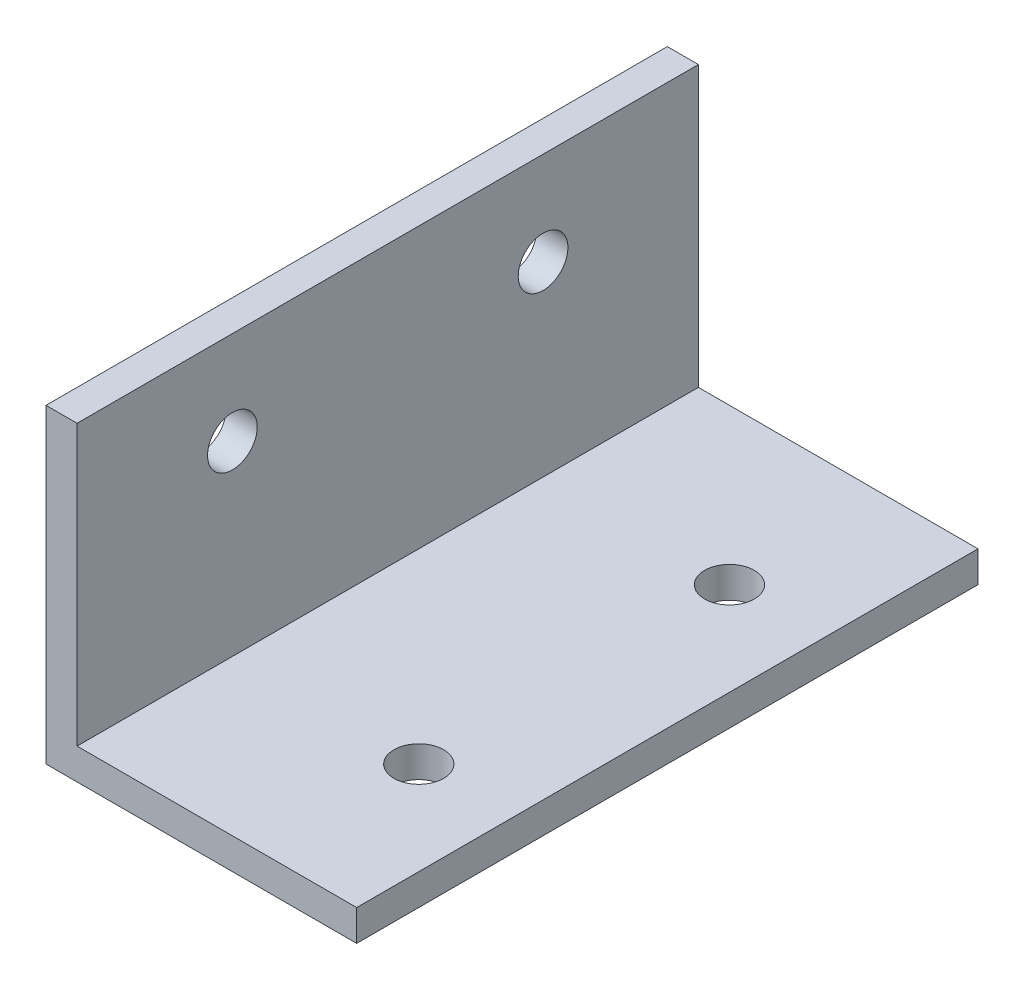
ISO-10303-21;
HEADER;
FILE_DESCRIPTION(('STEP AP214'),'2;1');
FILE_NAME('part.step','',(''),(''),'','','');
FILE_SCHEMA(('AUTOMOTIVE_DESIGN { 1 0 10303 214 1 1 1 1 }'));
ENDSEC;
DATA;
#1=APPLICATION_CONTEXT('core data for automotive mechanical design processes');
#2=APPLICATION_PROTOCOL_DEFINITION('international standard','automotive_design',2000,#1);
#3=PRODUCT_CONTEXT('',#1,'mechanical');
#4=PRODUCT('Part','Part','',(#3));
#5=PRODUCT_RELATED_PRODUCT_CATEGORY('part','',(#4));
#6=PRODUCT_DEFINITION_FORMATION('','',#4);
#7=PRODUCT_DEFINITION_CONTEXT('part definition',#1,'design');
#8=PRODUCT_DEFINITION('design','',#6,#7);
#9=PRODUCT_DEFINITION_SHAPE('','',#8);
#10=(LENGTH_UNIT() NAMED_UNIT(*) SI_UNIT(.MILLI.,.METRE.));
#11=(NAMED_UNIT(*) PLANE_ANGLE_UNIT() SI_UNIT($,.RADIAN.));
#12=(NAMED_UNIT(*) SI_UNIT($,.STERADIAN.) SOLID_ANGLE_UNIT());
#13=UNCERTAINTY_MEASURE_WITH_UNIT(LENGTH_MEASURE(1.E-05),#10,'distance_accuracy_value','');
#14=(GEOMETRIC_REPRESENTATION_CONTEXT(3) GLOBAL_UNCERTAINTY_ASSIGNED_CONTEXT((#13)) GLOBAL_UNIT_ASSIGNED_CONTEXT((#10,
#11,#12)) REPRESENTATION_CONTEXT('',''));
#15=CARTESIAN_POINT('',(0.,0.,0.));
#16=DIRECTION('',(0.,0.,1.));
#17=DIRECTION('',(1.,0.,0.));
#18=AXIS2_PLACEMENT_3D('',#15,#16,#17);
#19=CARTESIAN_POINT('',(0.,0.,50.));
#20=DIRECTION('',(1.,0.,0.));
#21=DIRECTION('',(0.,0.,-1.));
#22=AXIS2_PLACEMENT_3D('',#19,#20,#21);
#23=PLANE('',#22);
#24=CARTESIAN_POINT('',(0.,35.,25.));
#25=DIRECTION('',(1.,0.,0.));
#26=DIRECTION('',(0.,0.,-1.));
#27=AXIS2_PLACEMENT_3D('',#24,#25,#26);
#28=CIRCLE('',#27,3.99999999999999);
#29=CARTESIAN_POINT('',(0.,35.,21.));
#30=VERTEX_POINT('',#29);
#31=EDGE_CURVE('E162',#30,#30,#28,.T.);
#32=ORIENTED_EDGE('',*,*,#31,.T.);
#33=EDGE_LOOP('',(#32));
#34=FACE_BOUND('',#33,.T.);
#35=CARTESIAN_POINT('',(0.,35.,-25.));
#36=DIRECTION('',(1.,0.,0.));
#37=DIRECTION('',(0.,0.,-1.));
#38=AXIS2_PLACEMENT_3D('',#35,#36,#37);
#39=CIRCLE('',#38,4.00000000000001);
#40=CARTESIAN_POINT('',(0.,35.,-29.));
#41=VERTEX_POINT('',#40);
#42=EDGE_CURVE('E165',#41,#41,#39,.T.);
#43=ORIENTED_EDGE('',*,*,#42,.T.);
#44=EDGE_LOOP('',(#43));
#45=FACE_BOUND('',#44,.T.);
#46=DIRECTION('',(0.,-1.,0.));
#47=VECTOR('',#46,1.);
#48=CARTESIAN_POINT('',(0.,0.,-50.));
#49=LINE('',#48,#47);
#50=CARTESIAN_POINT('',(0.,50.,-50.));
#51=VERTEX_POINT('',#50);
#52=CARTESIAN_POINT('',(0.,0.,-50.));
#53=VERTEX_POINT('',#52);
#54=EDGE_CURVE('E117',#51,#53,#49,.T.);
#55=ORIENTED_EDGE('',*,*,#54,.T.);
#56=DIRECTION('',(0.,0.,-1.));
#57=VECTOR('',#56,1.);
#58=CARTESIAN_POINT('',(0.,0.,50.));
#59=LINE('',#58,#57);
#60=CARTESIAN_POINT('',(0.,0.,50.));
#61=VERTEX_POINT('',#60);
#62=EDGE_CURVE('E11',#61,#53,#59,.T.);
#63=ORIENTED_EDGE('',*,*,#62,.F.);
#64=DIRECTION('',(0.,-1.,0.));
#65=VECTOR('',#64,1.);
#66=CARTESIAN_POINT('',(0.,0.,50.));
#67=LINE('',#66,#65);
#68=CARTESIAN_POINT('',(0.,50.,50.));
#69=VERTEX_POINT('',#68);
#70=EDGE_CURVE('E128',#69,#61,#67,.T.);
#71=ORIENTED_EDGE('',*,*,#70,.F.);
#72=DIRECTION('',(0.,0.,-1.));
#73=VECTOR('',#72,1.);
#74=CARTESIAN_POINT('',(0.,50.,50.));
#75=LINE('',#74,#73);
#76=EDGE_CURVE('E113',#69,#51,#75,.T.);
#77=ORIENTED_EDGE('',*,*,#76,.T.);
#78=EDGE_LOOP('',(#55,#63,#71,#77));
#79=FACE_BOUND('',#78,.T.);
#80=ADVANCED_FACE('F33',(#34,#45,#79),#23,.F.);
#81=CARTESIAN_POINT('',(50.,0.,50.));
#82=DIRECTION('',(0.,1.,0.));
#83=DIRECTION('',(-1.,0.,0.));
#84=AXIS2_PLACEMENT_3D('',#81,#82,#83);
#85=PLANE('',#84);
#86=CARTESIAN_POINT('',(35.,0.,-25.));
#87=DIRECTION('',(0.,1.,0.));
#88=DIRECTION('',(-1.,0.,0.));
#89=AXIS2_PLACEMENT_3D('',#86,#87,#88);
#90=CIRCLE('',#89,4.00000000000001);
#91=CARTESIAN_POINT('',(31.,0.,-25.));
#92=VERTEX_POINT('',#91);
#93=EDGE_CURVE('E121',#92,#92,#90,.T.);
#94=ORIENTED_EDGE('',*,*,#93,.T.);
#95=EDGE_LOOP('',(#94));
#96=FACE_BOUND('',#95,.T.);
#97=CARTESIAN_POINT('',(35.,0.,25.));
#98=DIRECTION('',(0.,1.,0.));
#99=DIRECTION('',(-1.,0.,0.));
#100=AXIS2_PLACEMENT_3D('',#97,#98,#99);
#101=CIRCLE('',#100,4.00000000000001);
#102=CARTESIAN_POINT('',(31.,0.,25.));
#103=VERTEX_POINT('',#102);
#104=EDGE_CURVE('E181',#103,#103,#101,.T.);
#105=ORIENTED_EDGE('',*,*,#104,.T.);
#106=EDGE_LOOP('',(#105));
#107=FACE_BOUND('',#106,.T.);
#108=DIRECTION('',(1.,0.,0.));
#109=VECTOR('',#108,1.);
#110=CARTESIAN_POINT('',(50.,0.,-50.));
#111=LINE('',#110,#109);
#112=CARTESIAN_POINT('',(50.,0.,-50.));
#113=VERTEX_POINT('',#112);
#114=EDGE_CURVE('E120',#53,#113,#111,.T.);
#115=ORIENTED_EDGE('',*,*,#114,.T.);
#116=DIRECTION('',(0.,0.,-1.));
#117=VECTOR('',#116,1.);
#118=CARTESIAN_POINT('',(50.,0.,50.));
#119=LINE('',#118,#117);
#120=CARTESIAN_POINT('',(50.,0.,50.));
#121=VERTEX_POINT('',#120);
#122=EDGE_CURVE('E41',#121,#113,#119,.T.);
#123=ORIENTED_EDGE('',*,*,#122,.F.);
#124=DIRECTION('',(1.,0.,0.));
#125=VECTOR('',#124,1.);
#126=CARTESIAN_POINT('',(50.,0.,50.));
#127=LINE('',#126,#125);
#128=EDGE_CURVE('E86',#61,#121,#127,.T.);
#129=ORIENTED_EDGE('',*,*,#128,.F.);
#130=ORIENTED_EDGE('',*,*,#62,.T.);
#131=EDGE_LOOP('',(#115,#123,#129,#130));
#132=FACE_BOUND('',#131,.T.);
#133=ADVANCED_FACE('F153',(#96,#107,#132),#85,.F.);
#134=CARTESIAN_POINT('',(50.,5.,50.));
#135=DIRECTION('',(-1.,0.,0.));
#136=DIRECTION('',(0.,0.,1.));
#137=AXIS2_PLACEMENT_3D('',#134,#135,#136);
#138=PLANE('',#137);
#139=DIRECTION('',(0.,1.,0.));
#140=VECTOR('',#139,1.);
#141=CARTESIAN_POINT('',(50.,5.,-50.));
#142=LINE('',#141,#140);
#143=CARTESIAN_POINT('',(50.,5.,-50.));
#144=VERTEX_POINT('',#143);
#145=EDGE_CURVE('E123',#113,#144,#142,.T.);
#146=ORIENTED_EDGE('',*,*,#145,.T.);
#147=DIRECTION('',(0.,0.,-1.));
#148=VECTOR('',#147,1.);
#149=CARTESIAN_POINT('',(50.,5.,50.));
#150=LINE('',#149,#148);
#151=CARTESIAN_POINT('',(50.,5.,50.));
#152=VERTEX_POINT('',#151);
#153=EDGE_CURVE('E108',#152,#144,#150,.T.);
#154=ORIENTED_EDGE('',*,*,#153,.F.);
#155=DIRECTION('',(0.,1.,0.));
#156=VECTOR('',#155,1.);
#157=CARTESIAN_POINT('',(50.,5.,50.));
#158=LINE('',#157,#156);
#159=EDGE_CURVE('E99',#121,#152,#158,.T.);
#160=ORIENTED_EDGE('',*,*,#159,.F.);
#161=ORIENTED_EDGE('',*,*,#122,.T.);
#162=EDGE_LOOP('',(#146,#154,#160,#161));
#163=FACE_BOUND('',#162,.T.);
#164=ADVANCED_FACE('F134',(#163),#138,.F.);
#165=CARTESIAN_POINT('',(5.00000000000001,5.,50.));
#166=DIRECTION('',(0.,-1.,0.));
#167=DIRECTION('',(1.,0.,0.));
#168=AXIS2_PLACEMENT_3D('',#165,#166,#167);
#169=PLANE('',#168);
#170=CARTESIAN_POINT('',(35.,5.,-25.));
#171=DIRECTION('',(0.,1.,0.));
#172=DIRECTION('',(-1.,0.,0.));
#173=AXIS2_PLACEMENT_3D('',#170,#171,#172);
#174=CIRCLE('',#173,4.00000000000001);
#175=CARTESIAN_POINT('',(31.,5.,-25.));
#176=VERTEX_POINT('',#175);
#177=EDGE_CURVE('E178',#176,#176,#174,.T.);
#178=ORIENTED_EDGE('',*,*,#177,.F.);
#179=EDGE_LOOP('',(#178));
#180=FACE_BOUND('',#179,.T.);
#181=CARTESIAN_POINT('',(35.,5.,25.));
#182=DIRECTION('',(0.,1.,0.));
#183=DIRECTION('',(-1.,0.,0.));
#184=AXIS2_PLACEMENT_3D('',#181,#182,#183);
#185=CIRCLE('',#184,4.00000000000001);
#186=CARTESIAN_POINT('',(31.,5.,25.));
#187=VERTEX_POINT('',#186);
#188=EDGE_CURVE('E169',#187,#187,#185,.T.);
#189=ORIENTED_EDGE('',*,*,#188,.F.);
#190=EDGE_LOOP('',(#189));
#191=FACE_BOUND('',#190,.T.);
#192=DIRECTION('',(-1.,0.,0.));
#193=VECTOR('',#192,1.);
#194=CARTESIAN_POINT('',(5.00000000000001,5.,-50.));
#195=LINE('',#194,#193);
#196=CARTESIAN_POINT('',(5.00000000000001,5.,-50.));
#197=VERTEX_POINT('',#196);
#198=EDGE_CURVE('E107',#144,#197,#195,.T.);
#199=ORIENTED_EDGE('',*,*,#198,.T.);
#200=DIRECTION('',(0.,0.,-1.));
#201=VECTOR('',#200,1.);
#202=CARTESIAN_POINT('',(5.00000000000001,5.,50.));
#203=LINE('',#202,#201);
#204=CARTESIAN_POINT('',(5.00000000000001,5.,50.));
#205=VERTEX_POINT('',#204);
#206=EDGE_CURVE('E104',#205,#197,#203,.T.);
#207=ORIENTED_EDGE('',*,*,#206,.F.);
#208=DIRECTION('',(-1.,0.,0.));
#209=VECTOR('',#208,1.);
#210=CARTESIAN_POINT('',(5.00000000000001,5.,50.));
#211=LINE('',#210,#209);
#212=EDGE_CURVE('E93',#152,#205,#211,.T.);
#213=ORIENTED_EDGE('',*,*,#212,.F.);
#214=ORIENTED_EDGE('',*,*,#153,.T.);
#215=EDGE_LOOP('',(#199,#207,#213,#214));
#216=FACE_BOUND('',#215,.T.);
#217=ADVANCED_FACE('F105',(#180,#191,#216),#169,.F.);
#218=CARTESIAN_POINT('',(5.,50.,50.));
#219=DIRECTION('',(-1.,0.,0.));
#220=DIRECTION('',(0.,-1.,0.));
#221=AXIS2_PLACEMENT_3D('',#218,#219,#220);
#222=PLANE('',#221);
#223=CARTESIAN_POINT('',(5.,35.,25.));
#224=DIRECTION('',(1.,0.,0.));
#225=DIRECTION('',(0.,1.,0.));
#226=AXIS2_PLACEMENT_3D('',#223,#224,#225);
#227=CIRCLE('',#226,3.99999999999999);
#228=CARTESIAN_POINT('',(5.,39.,25.));
#229=VERTEX_POINT('',#228);
#230=EDGE_CURVE('E167',#229,#229,#227,.T.);
#231=ORIENTED_EDGE('',*,*,#230,.F.);
#232=EDGE_LOOP('',(#231));
#233=FACE_BOUND('',#232,.T.);
#234=CARTESIAN_POINT('',(5.,35.,-25.));
#235=DIRECTION('',(1.,0.,0.));
#236=DIRECTION('',(0.,1.,0.));
#237=AXIS2_PLACEMENT_3D('',#234,#235,#236);
#238=CIRCLE('',#237,4.00000000000001);
#239=CARTESIAN_POINT('',(5.,39.,-25.));
#240=VERTEX_POINT('',#239);
#241=EDGE_CURVE('E172',#240,#240,#238,.T.);
#242=ORIENTED_EDGE('',*,*,#241,.F.);
#243=EDGE_LOOP('',(#242));
#244=FACE_BOUND('',#243,.T.);
#245=DIRECTION('',(0.,1.,0.));
#246=VECTOR('',#245,1.);
#247=CARTESIAN_POINT('',(5.,50.,-50.));
#248=LINE('',#247,#246);
#249=CARTESIAN_POINT('',(5.,50.,-50.));
#250=VERTEX_POINT('',#249);
#251=EDGE_CURVE('E72',#197,#250,#248,.T.);
#252=ORIENTED_EDGE('',*,*,#251,.T.);
#253=DIRECTION('',(0.,0.,-1.));
#254=VECTOR('',#253,1.);
#255=CARTESIAN_POINT('',(5.,50.,50.));
#256=LINE('',#255,#254);
#257=CARTESIAN_POINT('',(5.,50.,50.));
#258=VERTEX_POINT('',#257);
#259=EDGE_CURVE('E109',#258,#250,#256,.T.);
#260=ORIENTED_EDGE('',*,*,#259,.F.);
#261=DIRECTION('',(0.,1.,0.));
#262=VECTOR('',#261,1.);
#263=CARTESIAN_POINT('',(5.,50.,50.));
#264=LINE('',#263,#262);
#265=EDGE_CURVE('E97',#205,#258,#264,.T.);
#266=ORIENTED_EDGE('',*,*,#265,.F.);
#267=ORIENTED_EDGE('',*,*,#206,.T.);
#268=EDGE_LOOP('',(#252,#260,#266,#267));
#269=FACE_BOUND('',#268,.T.);
#270=ADVANCED_FACE('F111',(#233,#244,#269),#222,.F.);
#271=CARTESIAN_POINT('',(0.,50.,50.));
#272=DIRECTION('',(0.,-1.,0.));
#273=DIRECTION('',(0.,0.,-1.));
#274=AXIS2_PLACEMENT_3D('',#271,#272,#273);
#275=PLANE('',#274);
#276=DIRECTION('',(-1.,0.,0.));
#277=VECTOR('',#276,1.);
#278=CARTESIAN_POINT('',(0.,50.,-50.));
#279=LINE('',#278,#277);
#280=EDGE_CURVE('E78',#250,#51,#279,.T.);
#281=ORIENTED_EDGE('',*,*,#280,.T.);
#282=ORIENTED_EDGE('',*,*,#76,.F.);
#283=DIRECTION('',(-1.,0.,0.));
#284=VECTOR('',#283,1.);
#285=CARTESIAN_POINT('',(0.,50.,50.));
#286=LINE('',#285,#284);
#287=EDGE_CURVE('E49',#258,#69,#286,.T.);
#288=ORIENTED_EDGE('',*,*,#287,.F.);
#289=ORIENTED_EDGE('',*,*,#259,.T.);
#290=EDGE_LOOP('',(#281,#282,#288,#289));
#291=FACE_BOUND('',#290,.T.);
#292=ADVANCED_FACE('F141',(#291),#275,.F.);
#293=CARTESIAN_POINT('',(0.,0.,50.));
#294=DIRECTION('',(0.,0.,-1.));
#295=DIRECTION('',(-1.,0.,0.));
#296=AXIS2_PLACEMENT_3D('',#293,#294,#295);
#297=PLANE('',#296);
#298=ORIENTED_EDGE('',*,*,#70,.T.);
#299=ORIENTED_EDGE('',*,*,#128,.T.);
#300=ORIENTED_EDGE('',*,*,#159,.T.);
#301=ORIENTED_EDGE('',*,*,#212,.T.);
#302=ORIENTED_EDGE('',*,*,#265,.T.);
#303=ORIENTED_EDGE('',*,*,#287,.T.);
#304=EDGE_LOOP('',(#298,#299,#300,#301,#302,#303));
#305=FACE_BOUND('',#304,.T.);
#306=ADVANCED_FACE('F95',(#305),#297,.F.);
#307=CARTESIAN_POINT('',(0.,0.,-50.));
#308=DIRECTION('',(0.,0.,-1.));
#309=DIRECTION('',(-1.,0.,0.));
#310=AXIS2_PLACEMENT_3D('',#307,#308,#309);
#311=PLANE('',#310);
#312=ORIENTED_EDGE('',*,*,#54,.F.);
#313=ORIENTED_EDGE('',*,*,#280,.F.);
#314=ORIENTED_EDGE('',*,*,#251,.F.);
#315=ORIENTED_EDGE('',*,*,#198,.F.);
#316=ORIENTED_EDGE('',*,*,#145,.F.);
#317=ORIENTED_EDGE('',*,*,#114,.F.);
#318=EDGE_LOOP('',(#312,#313,#314,#315,#316,#317));
#319=FACE_BOUND('',#318,.T.);
#320=ADVANCED_FACE('F137',(#319),#311,.T.);
#321=CARTESIAN_POINT('',(35.,0.,25.));
#322=DIRECTION('',(0.,1.,0.));
#323=DIRECTION('',(-1.,0.,0.));
#324=AXIS2_PLACEMENT_3D('',#321,#322,#323);
#325=CYLINDRICAL_SURFACE('',#324,4.00000000000001);
#326=ORIENTED_EDGE('',*,*,#104,.F.);
#327=EDGE_LOOP('',(#326));
#328=FACE_BOUND('',#327,.T.);
#329=ORIENTED_EDGE('',*,*,#188,.T.);
#330=EDGE_LOOP('',(#329));
#331=FACE_BOUND('',#330,.T.);
#332=ADVANCED_FACE('F189',(#328,#331),#325,.F.);
#333=CARTESIAN_POINT('',(35.,0.,-25.));
#334=DIRECTION('',(0.,1.,0.));
#335=DIRECTION('',(-1.,0.,0.));
#336=AXIS2_PLACEMENT_3D('',#333,#334,#335);
#337=CYLINDRICAL_SURFACE('',#336,4.00000000000001);
#338=ORIENTED_EDGE('',*,*,#93,.F.);
#339=EDGE_LOOP('',(#338));
#340=FACE_BOUND('',#339,.T.);
#341=ORIENTED_EDGE('',*,*,#177,.T.);
#342=EDGE_LOOP('',(#341));
#343=FACE_BOUND('',#342,.T.);
#344=ADVANCED_FACE('F200',(#340,#343),#337,.F.);
#345=CARTESIAN_POINT('',(-195.,35.,-25.));
#346=DIRECTION('',(1.,0.,0.));
#347=DIRECTION('',(0.,1.,0.));
#348=AXIS2_PLACEMENT_3D('',#345,#346,#347);
#349=CYLINDRICAL_SURFACE('',#348,4.00000000000001);
#350=ORIENTED_EDGE('',*,*,#241,.T.);
#351=EDGE_LOOP('',(#350));
#352=FACE_BOUND('',#351,.T.);
#353=ORIENTED_EDGE('',*,*,#42,.F.);
#354=EDGE_LOOP('',(#353));
#355=FACE_BOUND('',#354,.T.);
#356=ADVANCED_FACE('F202',(#352,#355),#349,.F.);
#357=CARTESIAN_POINT('',(-195.,35.,25.));
#358=DIRECTION('',(1.,0.,0.));
#359=DIRECTION('',(0.,1.,0.));
#360=AXIS2_PLACEMENT_3D('',#357,#358,#359);
#361=CYLINDRICAL_SURFACE('',#360,3.99999999999999);
#362=ORIENTED_EDGE('',*,*,#230,.T.);
#363=EDGE_LOOP('',(#362));
#364=FACE_BOUND('',#363,.T.);
#365=ORIENTED_EDGE('',*,*,#31,.F.);
#366=EDGE_LOOP('',(#365));
#367=FACE_BOUND('',#366,.T.);
#368=ADVANCED_FACE('F209',(#364,#367),#361,.F.);
#369=CLOSED_SHELL('',(#80,#133,#164,#217,#270,#292,#306,#320,#332,#344,#356,#368));
#370=MANIFOLD_SOLID_BREP('B2',#369);
#371=ADVANCED_BREP_SHAPE_REPRESENTATION('',(#18,#370),#14);
#372=SHAPE_DEFINITION_REPRESENTATION(#9,#371);
ENDSEC;
END-ISO-10303-21;
